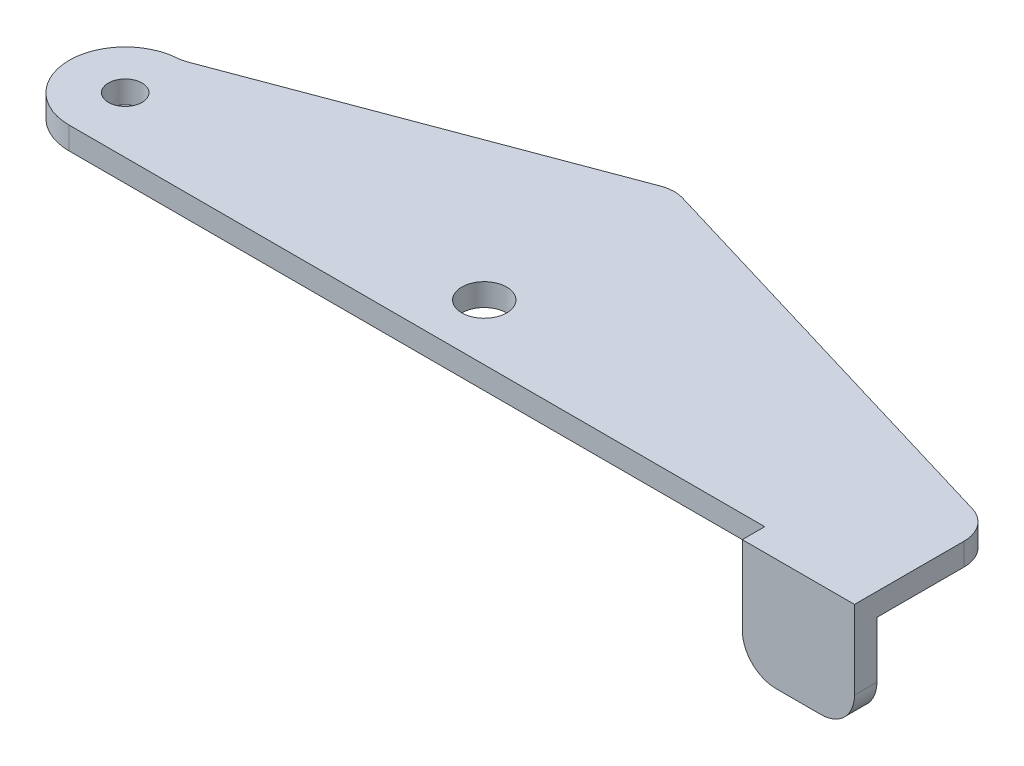
ISO-10303-21;
HEADER;
FILE_DESCRIPTION(('STEP AP214'),'2;1');
FILE_NAME('part.step','',(''),(''),'','','');
FILE_SCHEMA(('AUTOMOTIVE_DESIGN { 1 0 10303 214 1 1 1 1 }'));
ENDSEC;
DATA;
#1=APPLICATION_CONTEXT('core data for automotive mechanical design processes');
#2=APPLICATION_PROTOCOL_DEFINITION('international standard','automotive_design',2000,#1);
#3=PRODUCT_CONTEXT('',#1,'mechanical');
#4=PRODUCT('Part','Part','',(#3));
#5=PRODUCT_RELATED_PRODUCT_CATEGORY('part','',(#4));
#6=PRODUCT_DEFINITION_FORMATION('','',#4);
#7=PRODUCT_DEFINITION_CONTEXT('part definition',#1,'design');
#8=PRODUCT_DEFINITION('design','',#6,#7);
#9=PRODUCT_DEFINITION_SHAPE('','',#8);
#10=(LENGTH_UNIT() NAMED_UNIT(*) SI_UNIT(.MILLI.,.METRE.));
#11=(NAMED_UNIT(*) PLANE_ANGLE_UNIT() SI_UNIT($,.RADIAN.));
#12=(NAMED_UNIT(*) SI_UNIT($,.STERADIAN.) SOLID_ANGLE_UNIT());
#13=UNCERTAINTY_MEASURE_WITH_UNIT(LENGTH_MEASURE(1.E-05),#10,'distance_accuracy_value','');
#14=(GEOMETRIC_REPRESENTATION_CONTEXT(3) GLOBAL_UNCERTAINTY_ASSIGNED_CONTEXT((#13)) GLOBAL_UNIT_ASSIGNED_CONTEXT((#10,
#11,#12)) REPRESENTATION_CONTEXT('',''));
#15=CARTESIAN_POINT('',(0.,0.,0.));
#16=DIRECTION('',(0.,0.,1.));
#17=DIRECTION('',(1.,0.,0.));
#18=AXIS2_PLACEMENT_3D('',#15,#16,#17);
#19=CARTESIAN_POINT('',(-32.,2.,0.));
#20=DIRECTION('',(0.,1.,0.));
#21=DIRECTION('',(0.,0.,1.));
#22=AXIS2_PLACEMENT_3D('',#19,#20,#21);
#23=PLANE('',#22);
#24=CARTESIAN_POINT('',(-32.,2.,0.));
#25=DIRECTION('',(0.,1.,0.));
#26=DIRECTION('',(0.,0.,1.));
#27=AXIS2_PLACEMENT_3D('',#24,#25,#26);
#28=CIRCLE('',#27,1.5);
#29=CARTESIAN_POINT('',(-32.,2.,1.49999999999993));
#30=VERTEX_POINT('',#29);
#31=EDGE_CURVE('E180',#30,#30,#28,.T.);
#32=ORIENTED_EDGE('',*,*,#31,.F.);
#33=EDGE_LOOP('',(#32));
#34=FACE_BOUND('',#33,.T.);
#35=DIRECTION('',(0.,0.,-1.));
#36=VECTOR('',#35,1.);
#37=CARTESIAN_POINT('',(40.,2.,-5.00000000000006));
#38=LINE('',#37,#36);
#39=CARTESIAN_POINT('',(40.,2.,6.99999999999992));
#40=VERTEX_POINT('',#39);
#41=CARTESIAN_POINT('',(40.,2.,-2.76790804732689));
#42=VERTEX_POINT('',#41);
#43=EDGE_CURVE('E164',#40,#42,#38,.T.);
#44=ORIENTED_EDGE('',*,*,#43,.T.);
#45=CARTESIAN_POINT('',(37.,2.,-2.76790804732689));
#46=DIRECTION('',(0.,1.,0.));
#47=DIRECTION('',(0.,0.,1.));
#48=AXIS2_PLACEMENT_3D('',#45,#46,#47);
#49=CIRCLE('',#48,3.);
#50=CARTESIAN_POINT('',(37.862043656699,2.,-5.64138690299034));
#51=VERTEX_POINT('',#50);
#52=EDGE_CURVE('E212',#42,#51,#49,.T.);
#53=ORIENTED_EDGE('',*,*,#52,.T.);
#54=DIRECTION('',(-0.957826285221152,0.,-0.287347885566344));
#55=VECTOR('',#54,1.);
#56=CARTESIAN_POINT('',(0.,2.,-17.));
#57=LINE('',#56,#55);
#58=CARTESIAN_POINT('',(0.968576177915203,2.,-16.7094271466254));
#59=VERTEX_POINT('',#58);
#60=EDGE_CURVE('E166',#51,#59,#57,.T.);
#61=ORIENTED_EDGE('',*,*,#60,.T.);
#62=CARTESIAN_POINT('',(0.10653252121617,2.,-13.835948290962));
#63=DIRECTION('',(0.,1.,0.));
#64=DIRECTION('',(0.,0.,1.));
#65=AXIS2_PLACEMENT_3D('',#62,#63,#64);
#66=CIRCLE('',#65,3.);
#67=CARTESIAN_POINT('',(-0.946837803549001,2.,-16.6449358236691));
#68=VERTEX_POINT('',#67);
#69=EDGE_CURVE('E210',#59,#68,#66,.T.);
#70=ORIENTED_EDGE('',*,*,#69,.T.);
#71=DIRECTION('',(-0.936329177569045,0.,0.35112344158839));
#72=VECTOR('',#71,1.);
#73=CARTESIAN_POINT('',(-32.,2.,-5.00000000000005));
#74=LINE('',#73,#72);
#75=CARTESIAN_POINT('',(-31.5517492453461,2.,-5.16809403299527));
#76=VERTEX_POINT('',#75);
#77=EDGE_CURVE('E174',#68,#76,#74,.T.);
#78=ORIENTED_EDGE('',*,*,#77,.T.);
#79=CARTESIAN_POINT('',(-32.6051195701112,2.,-7.97708156570241));
#80=DIRECTION('',(0.,1.,0.));
#81=DIRECTION('',(0.,0.,1.));
#82=AXIS2_PLACEMENT_3D('',#79,#80,#81);
#83=CIRCLE('',#82,3.);
#84=CARTESIAN_POINT('',(-32.3781997313195,2.,-4.98567597856403));
#85=VERTEX_POINT('',#84);
#86=EDGE_CURVE('E216',#76,#85,#83,.F.);
#87=ORIENTED_EDGE('',*,*,#86,.T.);
#88=CARTESIAN_POINT('',(-32.,2.,0.));
#89=DIRECTION('',(0.,1.,0.));
#90=DIRECTION('',(0.,0.,1.));
#91=AXIS2_PLACEMENT_3D('',#88,#89,#90);
#92=CIRCLE('',#91,4.99999999999999);
#93=CARTESIAN_POINT('',(-32.,2.,4.99999999999992));
#94=VERTEX_POINT('',#93);
#95=EDGE_CURVE('E163',#85,#94,#92,.T.);
#96=ORIENTED_EDGE('',*,*,#95,.T.);
#97=DIRECTION('',(1.,0.,0.));
#98=VECTOR('',#97,1.);
#99=CARTESIAN_POINT('',(40.,2.,4.99999999999994));
#100=LINE('',#99,#98);
#101=CARTESIAN_POINT('',(30.,2.,4.99999999999992));
#102=VERTEX_POINT('',#101);
#103=EDGE_CURVE('E153',#94,#102,#100,.T.);
#104=ORIENTED_EDGE('',*,*,#103,.T.);
#105=DIRECTION('',(0.,0.,1.));
#106=VECTOR('',#105,1.);
#107=CARTESIAN_POINT('',(30.,2.,4.99999999999992));
#108=LINE('',#107,#106);
#109=CARTESIAN_POINT('',(30.,2.,6.99999999999992));
#110=VERTEX_POINT('',#109);
#111=EDGE_CURVE('E134',#102,#110,#108,.T.);
#112=ORIENTED_EDGE('',*,*,#111,.T.);
#113=DIRECTION('',(1.,0.,0.));
#114=VECTOR('',#113,1.);
#115=CARTESIAN_POINT('',(40.,2.,6.99999999999992));
#116=LINE('',#115,#114);
#117=EDGE_CURVE('E146',#110,#40,#116,.T.);
#118=ORIENTED_EDGE('',*,*,#117,.T.);
#119=EDGE_LOOP('',(#44,#53,#61,#70,#78,#87,#96,#104,#112,#118));
#120=FACE_BOUND('',#119,.T.);
#121=CARTESIAN_POINT('',(0.,2.,0.));
#122=DIRECTION('',(0.,1.,0.));
#123=DIRECTION('',(0.,0.,1.));
#124=AXIS2_PLACEMENT_3D('',#121,#122,#123);
#125=CIRCLE('',#124,2.);
#126=CARTESIAN_POINT('',(0.,2.,2.));
#127=VERTEX_POINT('',#126);
#128=EDGE_CURVE('E258',#127,#127,#125,.T.);
#129=ORIENTED_EDGE('',*,*,#128,.F.);
#130=EDGE_LOOP('',(#129));
#131=FACE_BOUND('',#130,.T.);
#132=ADVANCED_FACE('F34',(#34,#120,#131),#23,.T.);
#133=CARTESIAN_POINT('',(-32.,0.,0.));
#134=DIRECTION('',(0.,1.,0.));
#135=DIRECTION('',(0.,0.,1.));
#136=AXIS2_PLACEMENT_3D('',#133,#134,#135);
#137=PLANE('',#136);
#138=CARTESIAN_POINT('',(-32.,0.,0.));
#139=DIRECTION('',(0.,1.,0.));
#140=DIRECTION('',(0.,0.,1.));
#141=AXIS2_PLACEMENT_3D('',#138,#139,#140);
#142=CIRCLE('',#141,1.5);
#143=CARTESIAN_POINT('',(-32.,0.,1.49999999999993));
#144=VERTEX_POINT('',#143);
#145=EDGE_CURVE('E261',#144,#144,#142,.T.);
#146=ORIENTED_EDGE('',*,*,#145,.T.);
#147=EDGE_LOOP('',(#146));
#148=FACE_BOUND('',#147,.T.);
#149=DIRECTION('',(-0.957826285221152,0.,-0.287347885566344));
#150=VECTOR('',#149,1.);
#151=CARTESIAN_POINT('',(0.,0.,-17.));
#152=LINE('',#151,#150);
#153=CARTESIAN_POINT('',(37.862043656699,0.,-5.64138690299034));
#154=VERTEX_POINT('',#153);
#155=CARTESIAN_POINT('',(0.968576177915203,0.,-16.7094271466254));
#156=VERTEX_POINT('',#155);
#157=EDGE_CURVE('E185',#154,#156,#152,.T.);
#158=ORIENTED_EDGE('',*,*,#157,.F.);
#159=CARTESIAN_POINT('',(37.,0.,-2.76790804732689));
#160=DIRECTION('',(0.,1.,0.));
#161=DIRECTION('',(0.,0.,1.));
#162=AXIS2_PLACEMENT_3D('',#159,#160,#161);
#163=CIRCLE('',#162,3.);
#164=CARTESIAN_POINT('',(40.,0.,-2.76790804732689));
#165=VERTEX_POINT('',#164);
#166=EDGE_CURVE('E206',#154,#165,#163,.F.);
#167=ORIENTED_EDGE('',*,*,#166,.T.);
#168=DIRECTION('',(0.,0.,-1.));
#169=VECTOR('',#168,1.);
#170=CARTESIAN_POINT('',(40.,0.,-5.00000000000006));
#171=LINE('',#170,#169);
#172=CARTESIAN_POINT('',(40.,0.,4.99999999999994));
#173=VERTEX_POINT('',#172);
#174=EDGE_CURVE('E182',#173,#165,#171,.T.);
#175=ORIENTED_EDGE('',*,*,#174,.F.);
#176=DIRECTION('',(-1.,0.,0.));
#177=VECTOR('',#176,1.);
#178=CARTESIAN_POINT('',(-32.,0.,4.99999999999994));
#179=LINE('',#178,#177);
#180=CARTESIAN_POINT('',(30.,0.,4.99999999999992));
#181=VERTEX_POINT('',#180);
#182=EDGE_CURVE('E240',#173,#181,#179,.T.);
#183=ORIENTED_EDGE('',*,*,#182,.T.);
#184=DIRECTION('',(1.,0.,0.));
#185=VECTOR('',#184,1.);
#186=CARTESIAN_POINT('',(40.,0.,4.99999999999994));
#187=LINE('',#186,#185);
#188=CARTESIAN_POINT('',(-32.,0.,4.99999999999992));
#189=VERTEX_POINT('',#188);
#190=EDGE_CURVE('E156',#189,#181,#187,.T.);
#191=ORIENTED_EDGE('',*,*,#190,.F.);
#192=CARTESIAN_POINT('',(-32.,0.,0.));
#193=DIRECTION('',(0.,1.,0.));
#194=DIRECTION('',(0.,0.,1.));
#195=AXIS2_PLACEMENT_3D('',#192,#193,#194);
#196=CIRCLE('',#195,4.99999999999999);
#197=CARTESIAN_POINT('',(-32.3781997313195,0.,-4.98567597856403));
#198=VERTEX_POINT('',#197);
#199=EDGE_CURVE('E178',#198,#189,#196,.T.);
#200=ORIENTED_EDGE('',*,*,#199,.F.);
#201=CARTESIAN_POINT('',(-32.6051195701112,0.,-7.97708156570241));
#202=DIRECTION('',(0.,1.,0.));
#203=DIRECTION('',(0.,0.,1.));
#204=AXIS2_PLACEMENT_3D('',#201,#202,#203);
#205=CIRCLE('',#204,3.);
#206=CARTESIAN_POINT('',(-31.5517492453461,0.,-5.16809403299527));
#207=VERTEX_POINT('',#206);
#208=EDGE_CURVE('E214',#198,#207,#205,.T.);
#209=ORIENTED_EDGE('',*,*,#208,.T.);
#210=DIRECTION('',(-0.936329177569045,0.,0.35112344158839));
#211=VECTOR('',#210,1.);
#212=CARTESIAN_POINT('',(-32.,0.,-5.00000000000005));
#213=LINE('',#212,#211);
#214=CARTESIAN_POINT('',(-0.946837803549001,0.,-16.6449358236691));
#215=VERTEX_POINT('',#214);
#216=EDGE_CURVE('E168',#215,#207,#213,.T.);
#217=ORIENTED_EDGE('',*,*,#216,.F.);
#218=CARTESIAN_POINT('',(0.10653252121617,0.,-13.835948290962));
#219=DIRECTION('',(0.,1.,0.));
#220=DIRECTION('',(0.,0.,1.));
#221=AXIS2_PLACEMENT_3D('',#218,#219,#220);
#222=CIRCLE('',#221,3.);
#223=EDGE_CURVE('E204',#215,#156,#222,.F.);
#224=ORIENTED_EDGE('',*,*,#223,.T.);
#225=EDGE_LOOP('',(#158,#167,#175,#183,#191,#200,#209,#217,#224));
#226=FACE_BOUND('',#225,.T.);
#227=CARTESIAN_POINT('',(0.,0.,0.));
#228=DIRECTION('',(0.,1.,0.));
#229=DIRECTION('',(0.,0.,1.));
#230=AXIS2_PLACEMENT_3D('',#227,#228,#229);
#231=CIRCLE('',#230,2.);
#232=CARTESIAN_POINT('',(0.,0.,2.));
#233=VERTEX_POINT('',#232);
#234=EDGE_CURVE('E257',#233,#233,#231,.T.);
#235=ORIENTED_EDGE('',*,*,#234,.T.);
#236=EDGE_LOOP('',(#235));
#237=FACE_BOUND('',#236,.T.);
#238=ADVANCED_FACE('F268',(#148,#226,#237),#137,.F.);
#239=CARTESIAN_POINT('',(-32.,2.,0.));
#240=DIRECTION('',(0.,-1.,0.));
#241=DIRECTION('',(0.,0.,-1.));
#242=AXIS2_PLACEMENT_3D('',#239,#240,#241);
#243=CYLINDRICAL_SURFACE('',#242,4.99999999999999);
#244=ORIENTED_EDGE('',*,*,#95,.F.);
#245=DIRECTION('',(0.,-1.,0.));
#246=VECTOR('',#245,1.);
#247=CARTESIAN_POINT('',(-32.3781997313195,2.,-4.98567597856403));
#248=LINE('',#247,#246);
#249=EDGE_CURVE('E191',#85,#198,#248,.T.);
#250=ORIENTED_EDGE('',*,*,#249,.T.);
#251=ORIENTED_EDGE('',*,*,#199,.T.);
#252=DIRECTION('',(0.,-1.,0.));
#253=VECTOR('',#252,1.);
#254=CARTESIAN_POINT('',(-32.,2.,4.99999999999992));
#255=LINE('',#254,#253);
#256=EDGE_CURVE('E177',#94,#189,#255,.T.);
#257=ORIENTED_EDGE('',*,*,#256,.F.);
#258=EDGE_LOOP('',(#244,#250,#251,#257));
#259=FACE_BOUND('',#258,.T.);
#260=ADVANCED_FACE('F292',(#259),#243,.T.);
#261=CARTESIAN_POINT('',(40.,2.,4.99999999999994));
#262=DIRECTION('',(0.,0.,-1.));
#263=DIRECTION('',(-1.,0.,0.));
#264=AXIS2_PLACEMENT_3D('',#261,#262,#263);
#265=PLANE('',#264);
#266=ORIENTED_EDGE('',*,*,#190,.T.);
#267=DIRECTION('',(0.,1.,0.));
#268=VECTOR('',#267,1.);
#269=CARTESIAN_POINT('',(30.,-8.,4.99999999999992));
#270=LINE('',#269,#268);
#271=EDGE_CURVE('E138',#181,#102,#270,.T.);
#272=ORIENTED_EDGE('',*,*,#271,.T.);
#273=ORIENTED_EDGE('',*,*,#103,.F.);
#274=ORIENTED_EDGE('',*,*,#256,.T.);
#275=EDGE_LOOP('',(#266,#272,#273,#274));
#276=FACE_BOUND('',#275,.T.);
#277=ADVANCED_FACE('F151',(#276),#265,.F.);
#278=CARTESIAN_POINT('',(40.,2.,-5.00000000000006));
#279=DIRECTION('',(-1.,0.,0.));
#280=DIRECTION('',(0.,0.,1.));
#281=AXIS2_PLACEMENT_3D('',#278,#279,#280);
#282=PLANE('',#281);
#283=DIRECTION('',(0.,1.,0.));
#284=VECTOR('',#283,1.);
#285=CARTESIAN_POINT('',(40.,-8.,6.99999999999992));
#286=LINE('',#285,#284);
#287=CARTESIAN_POINT('',(40.,-5.,6.99999999999992));
#288=VERTEX_POINT('',#287);
#289=EDGE_CURVE('E232',#288,#40,#286,.T.);
#290=ORIENTED_EDGE('',*,*,#289,.F.);
#291=DIRECTION('',(0.,0.,-1.));
#292=VECTOR('',#291,1.);
#293=CARTESIAN_POINT('',(40.,-5.,4.99999999999992));
#294=LINE('',#293,#292);
#295=CARTESIAN_POINT('',(40.,-5.,4.99999999999992));
#296=VERTEX_POINT('',#295);
#297=EDGE_CURVE('E218',#288,#296,#294,.T.);
#298=ORIENTED_EDGE('',*,*,#297,.T.);
#299=DIRECTION('',(0.,1.,0.));
#300=VECTOR('',#299,1.);
#301=CARTESIAN_POINT('',(40.,-8.,4.99999999999992));
#302=LINE('',#301,#300);
#303=EDGE_CURVE('E158',#296,#173,#302,.T.);
#304=ORIENTED_EDGE('',*,*,#303,.T.);
#305=ORIENTED_EDGE('',*,*,#174,.T.);
#306=DIRECTION('',(0.,-1.,0.));
#307=VECTOR('',#306,1.);
#308=CARTESIAN_POINT('',(40.,2.,-2.76790804732689));
#309=LINE('',#308,#307);
#310=EDGE_CURVE('E208',#165,#42,#309,.F.);
#311=ORIENTED_EDGE('',*,*,#310,.T.);
#312=ORIENTED_EDGE('',*,*,#43,.F.);
#313=EDGE_LOOP('',(#290,#298,#304,#305,#311,#312));
#314=FACE_BOUND('',#313,.T.);
#315=ADVANCED_FACE('F238',(#314),#282,.F.);
#316=CARTESIAN_POINT('',(0.,2.,-17.));
#317=DIRECTION('',(-0.287347885566344,0.,0.957826285221152));
#318=DIRECTION('',(0.957826285221152,0.,0.287347885566344));
#319=AXIS2_PLACEMENT_3D('',#316,#317,#318);
#320=PLANE('',#319);
#321=ORIENTED_EDGE('',*,*,#60,.F.);
#322=DIRECTION('',(0.,-1.,0.));
#323=VECTOR('',#322,1.);
#324=CARTESIAN_POINT('',(37.862043656699,2.,-5.64138690299034));
#325=LINE('',#324,#323);
#326=EDGE_CURVE('E201',#51,#154,#325,.T.);
#327=ORIENTED_EDGE('',*,*,#326,.T.);
#328=ORIENTED_EDGE('',*,*,#157,.T.);
#329=DIRECTION('',(0.,-1.,0.));
#330=VECTOR('',#329,1.);
#331=CARTESIAN_POINT('',(0.968576177915202,2.,-16.7094271466254));
#332=LINE('',#331,#330);
#333=EDGE_CURVE('E199',#156,#59,#332,.F.);
#334=ORIENTED_EDGE('',*,*,#333,.T.);
#335=EDGE_LOOP('',(#321,#327,#328,#334));
#336=FACE_BOUND('',#335,.T.);
#337=ADVANCED_FACE('F283',(#336),#320,.F.);
#338=CARTESIAN_POINT('',(-32.,2.,-5.00000000000005));
#339=DIRECTION('',(0.35112344158839,0.,0.936329177569045));
#340=DIRECTION('',(0.936329177569045,0.,-0.35112344158839));
#341=AXIS2_PLACEMENT_3D('',#338,#339,#340);
#342=PLANE('',#341);
#343=ORIENTED_EDGE('',*,*,#216,.T.);
#344=DIRECTION('',(0.,1.,0.));
#345=VECTOR('',#344,1.);
#346=CARTESIAN_POINT('',(-31.5517492453461,2.,-5.16809403299527));
#347=LINE('',#346,#345);
#348=EDGE_CURVE('E197',#207,#76,#347,.T.);
#349=ORIENTED_EDGE('',*,*,#348,.T.);
#350=ORIENTED_EDGE('',*,*,#77,.F.);
#351=DIRECTION('',(0.,-1.,0.));
#352=VECTOR('',#351,1.);
#353=CARTESIAN_POINT('',(-0.946837803549001,2.,-16.6449358236691));
#354=LINE('',#353,#352);
#355=EDGE_CURVE('E194',#68,#215,#354,.T.);
#356=ORIENTED_EDGE('',*,*,#355,.T.);
#357=EDGE_LOOP('',(#343,#349,#350,#356));
#358=FACE_BOUND('',#357,.T.);
#359=ADVANCED_FACE('F274',(#358),#342,.F.);
#360=CARTESIAN_POINT('',(-32.,2.,0.));
#361=DIRECTION('',(0.,-1.,0.));
#362=DIRECTION('',(0.,0.,-1.));
#363=AXIS2_PLACEMENT_3D('',#360,#361,#362);
#364=CYLINDRICAL_SURFACE('',#363,1.5);
#365=ORIENTED_EDGE('',*,*,#31,.T.);
#366=EDGE_LOOP('',(#365));
#367=FACE_BOUND('',#366,.T.);
#368=ORIENTED_EDGE('',*,*,#145,.F.);
#369=EDGE_LOOP('',(#368));
#370=FACE_BOUND('',#369,.T.);
#371=ADVANCED_FACE('F271',(#367,#370),#364,.F.);
#372=CARTESIAN_POINT('',(0.,2.,0.));
#373=DIRECTION('',(0.,-1.,0.));
#374=DIRECTION('',(0.,0.,-1.));
#375=AXIS2_PLACEMENT_3D('',#372,#373,#374);
#376=CYLINDRICAL_SURFACE('',#375,2.);
#377=ORIENTED_EDGE('',*,*,#128,.T.);
#378=EDGE_LOOP('',(#377));
#379=FACE_BOUND('',#378,.T.);
#380=ORIENTED_EDGE('',*,*,#234,.F.);
#381=EDGE_LOOP('',(#380));
#382=FACE_BOUND('',#381,.T.);
#383=ADVANCED_FACE('F273',(#379,#382),#376,.F.);
#384=CARTESIAN_POINT('',(40.,-8.,4.99999999999992));
#385=DIRECTION('',(0.,0.,-1.));
#386=DIRECTION('',(-1.,0.,0.));
#387=AXIS2_PLACEMENT_3D('',#384,#385,#386);
#388=PLANE('',#387);
#389=ORIENTED_EDGE('',*,*,#303,.F.);
#390=CARTESIAN_POINT('',(37.,-5.,4.99999999999992));
#391=DIRECTION('',(0.,0.,-1.));
#392=DIRECTION('',(-1.,0.,0.));
#393=AXIS2_PLACEMENT_3D('',#390,#391,#392);
#394=CIRCLE('',#393,3.);
#395=CARTESIAN_POINT('',(37.,-8.,4.99999999999992));
#396=VERTEX_POINT('',#395);
#397=EDGE_CURVE('E223',#296,#396,#394,.T.);
#398=ORIENTED_EDGE('',*,*,#397,.T.);
#399=DIRECTION('',(-1.,0.,0.));
#400=VECTOR('',#399,1.);
#401=CARTESIAN_POINT('',(40.,-8.,4.99999999999992));
#402=LINE('',#401,#400);
#403=CARTESIAN_POINT('',(33.,-8.,4.99999999999992));
#404=VERTEX_POINT('',#403);
#405=EDGE_CURVE('E246',#396,#404,#402,.T.);
#406=ORIENTED_EDGE('',*,*,#405,.T.);
#407=CARTESIAN_POINT('',(33.,-5.,4.99999999999992));
#408=DIRECTION('',(0.,0.,-1.));
#409=DIRECTION('',(-1.,0.,0.));
#410=AXIS2_PLACEMENT_3D('',#407,#408,#409);
#411=CIRCLE('',#410,3.);
#412=CARTESIAN_POINT('',(30.,-5.,4.99999999999992));
#413=VERTEX_POINT('',#412);
#414=EDGE_CURVE('E221',#404,#413,#411,.T.);
#415=ORIENTED_EDGE('',*,*,#414,.T.);
#416=EDGE_CURVE('E157',#413,#181,#270,.T.);
#417=ORIENTED_EDGE('',*,*,#416,.T.);
#418=ORIENTED_EDGE('',*,*,#182,.F.);
#419=EDGE_LOOP('',(#389,#398,#406,#415,#417,#418));
#420=FACE_BOUND('',#419,.T.);
#421=ADVANCED_FACE('F245',(#420),#388,.T.);
#422=CARTESIAN_POINT('',(40.,-8.,6.99999999999992));
#423=DIRECTION('',(0.,0.,1.));
#424=DIRECTION('',(1.,0.,0.));
#425=AXIS2_PLACEMENT_3D('',#422,#423,#424);
#426=PLANE('',#425);
#427=DIRECTION('',(1.,0.,0.));
#428=VECTOR('',#427,1.);
#429=CARTESIAN_POINT('',(40.,-8.,6.99999999999992));
#430=LINE('',#429,#428);
#431=CARTESIAN_POINT('',(33.,-8.,6.99999999999992));
#432=VERTEX_POINT('',#431);
#433=CARTESIAN_POINT('',(37.,-8.,6.99999999999992));
#434=VERTEX_POINT('',#433);
#435=EDGE_CURVE('E234',#432,#434,#430,.T.);
#436=ORIENTED_EDGE('',*,*,#435,.T.);
#437=CARTESIAN_POINT('',(37.,-5.,6.99999999999992));
#438=DIRECTION('',(0.,0.,1.));
#439=DIRECTION('',(1.,0.,0.));
#440=AXIS2_PLACEMENT_3D('',#437,#438,#439);
#441=CIRCLE('',#440,3.);
#442=EDGE_CURVE('E42',#434,#288,#441,.T.);
#443=ORIENTED_EDGE('',*,*,#442,.T.);
#444=ORIENTED_EDGE('',*,*,#289,.T.);
#445=ORIENTED_EDGE('',*,*,#117,.F.);
#446=DIRECTION('',(0.,1.,0.));
#447=VECTOR('',#446,1.);
#448=CARTESIAN_POINT('',(30.,-8.,6.99999999999992));
#449=LINE('',#448,#447);
#450=CARTESIAN_POINT('',(30.,-5.,6.99999999999992));
#451=VERTEX_POINT('',#450);
#452=EDGE_CURVE('E141',#451,#110,#449,.T.);
#453=ORIENTED_EDGE('',*,*,#452,.F.);
#454=CARTESIAN_POINT('',(33.,-5.,6.99999999999992));
#455=DIRECTION('',(0.,0.,1.));
#456=DIRECTION('',(1.,0.,0.));
#457=AXIS2_PLACEMENT_3D('',#454,#455,#456);
#458=CIRCLE('',#457,3.);
#459=EDGE_CURVE('E49',#451,#432,#458,.T.);
#460=ORIENTED_EDGE('',*,*,#459,.T.);
#461=EDGE_LOOP('',(#436,#443,#444,#445,#453,#460));
#462=FACE_BOUND('',#461,.T.);
#463=ADVANCED_FACE('F231',(#462),#426,.T.);
#464=CARTESIAN_POINT('',(30.,-8.,4.99999999999992));
#465=DIRECTION('',(-1.,0.,0.));
#466=DIRECTION('',(0.,0.,1.));
#467=AXIS2_PLACEMENT_3D('',#464,#465,#466);
#468=PLANE('',#467);
#469=ORIENTED_EDGE('',*,*,#416,.F.);
#470=DIRECTION('',(0.,0.,1.));
#471=VECTOR('',#470,1.);
#472=CARTESIAN_POINT('',(30.,-5.,4.99999999999992));
#473=LINE('',#472,#471);
#474=EDGE_CURVE('E11',#413,#451,#473,.T.);
#475=ORIENTED_EDGE('',*,*,#474,.T.);
#476=ORIENTED_EDGE('',*,*,#452,.T.);
#477=ORIENTED_EDGE('',*,*,#111,.F.);
#478=ORIENTED_EDGE('',*,*,#271,.F.);
#479=EDGE_LOOP('',(#469,#475,#476,#477,#478));
#480=FACE_BOUND('',#479,.T.);
#481=ADVANCED_FACE('F137',(#480),#468,.T.);
#482=CARTESIAN_POINT('',(0.,-8.,0.));
#483=DIRECTION('',(0.,-1.,0.));
#484=DIRECTION('',(0.,0.,-1.));
#485=AXIS2_PLACEMENT_3D('',#482,#483,#484);
#486=PLANE('',#485);
#487=ORIENTED_EDGE('',*,*,#405,.F.);
#488=DIRECTION('',(0.,0.,-1.));
#489=VECTOR('',#488,1.);
#490=CARTESIAN_POINT('',(37.,-8.,6.99999999999992));
#491=LINE('',#490,#489);
#492=EDGE_CURVE('E56',#396,#434,#491,.F.);
#493=ORIENTED_EDGE('',*,*,#492,.T.);
#494=ORIENTED_EDGE('',*,*,#435,.F.);
#495=DIRECTION('',(0.,0.,1.));
#496=VECTOR('',#495,1.);
#497=CARTESIAN_POINT('',(33.,-8.,0.));
#498=LINE('',#497,#496);
#499=EDGE_CURVE('E225',#432,#404,#498,.F.);
#500=ORIENTED_EDGE('',*,*,#499,.T.);
#501=EDGE_LOOP('',(#487,#493,#494,#500));
#502=FACE_BOUND('',#501,.T.);
#503=ADVANCED_FACE('F249',(#502),#486,.T.);
#504=CARTESIAN_POINT('',(-32.6051195701112,2.,-7.97708156570241));
#505=DIRECTION('',(0.,-1.,0.));
#506=DIRECTION('',(0.,0.,-1.));
#507=AXIS2_PLACEMENT_3D('',#504,#505,#506);
#508=CYLINDRICAL_SURFACE('',#507,3.);
#509=ORIENTED_EDGE('',*,*,#86,.F.);
#510=ORIENTED_EDGE('',*,*,#348,.F.);
#511=ORIENTED_EDGE('',*,*,#208,.F.);
#512=ORIENTED_EDGE('',*,*,#249,.F.);
#513=EDGE_LOOP('',(#509,#510,#511,#512));
#514=FACE_BOUND('',#513,.T.);
#515=ADVANCED_FACE('F306',(#514),#508,.F.);
#516=CARTESIAN_POINT('',(37.,2.,-2.76790804732689));
#517=DIRECTION('',(0.,-1.,0.));
#518=DIRECTION('',(0.,0.,-1.));
#519=AXIS2_PLACEMENT_3D('',#516,#517,#518);
#520=CYLINDRICAL_SURFACE('',#519,3.);
#521=ORIENTED_EDGE('',*,*,#52,.F.);
#522=ORIENTED_EDGE('',*,*,#310,.F.);
#523=ORIENTED_EDGE('',*,*,#166,.F.);
#524=ORIENTED_EDGE('',*,*,#326,.F.);
#525=EDGE_LOOP('',(#521,#522,#523,#524));
#526=FACE_BOUND('',#525,.T.);
#527=ADVANCED_FACE('F309',(#526),#520,.T.);
#528=CARTESIAN_POINT('',(0.10653252121617,2.,-13.835948290962));
#529=DIRECTION('',(0.,-1.,0.));
#530=DIRECTION('',(0.,0.,-1.));
#531=AXIS2_PLACEMENT_3D('',#528,#529,#530);
#532=CYLINDRICAL_SURFACE('',#531,3.);
#533=ORIENTED_EDGE('',*,*,#69,.F.);
#534=ORIENTED_EDGE('',*,*,#333,.F.);
#535=ORIENTED_EDGE('',*,*,#223,.F.);
#536=ORIENTED_EDGE('',*,*,#355,.F.);
#537=EDGE_LOOP('',(#533,#534,#535,#536));
#538=FACE_BOUND('',#537,.T.);
#539=ADVANCED_FACE('F313',(#538),#532,.T.);
#540=CARTESIAN_POINT('',(37.,-5.,-5.00000000000006));
#541=DIRECTION('',(0.,0.,1.));
#542=DIRECTION('',(1.,0.,0.));
#543=AXIS2_PLACEMENT_3D('',#540,#541,#542);
#544=CYLINDRICAL_SURFACE('',#543,3.);
#545=ORIENTED_EDGE('',*,*,#442,.F.);
#546=ORIENTED_EDGE('',*,*,#492,.F.);
#547=ORIENTED_EDGE('',*,*,#397,.F.);
#548=ORIENTED_EDGE('',*,*,#297,.F.);
#549=EDGE_LOOP('',(#545,#546,#547,#548));
#550=FACE_BOUND('',#549,.T.);
#551=ADVANCED_FACE('F242',(#550),#544,.T.);
#552=CARTESIAN_POINT('',(33.,-5.,4.99999999999992));
#553=DIRECTION('',(0.,0.,1.));
#554=DIRECTION('',(1.,0.,0.));
#555=AXIS2_PLACEMENT_3D('',#552,#553,#554);
#556=CYLINDRICAL_SURFACE('',#555,3.);
#557=ORIENTED_EDGE('',*,*,#414,.F.);
#558=ORIENTED_EDGE('',*,*,#499,.F.);
#559=ORIENTED_EDGE('',*,*,#459,.F.);
#560=ORIENTED_EDGE('',*,*,#474,.F.);
#561=EDGE_LOOP('',(#557,#558,#559,#560));
#562=FACE_BOUND('',#561,.T.);
#563=ADVANCED_FACE('F36',(#562),#556,.T.);
#564=CLOSED_SHELL('',(#132,#238,#260,#277,#315,#337,#359,#371,#383,#421,#463,#481,#503,#515,
#527,#539,#551,#563));
#565=MANIFOLD_SOLID_BREP('B2',#564);
#566=ADVANCED_BREP_SHAPE_REPRESENTATION('',(#18,#565),#14);
#567=SHAPE_DEFINITION_REPRESENTATION(#9,#566);
ENDSEC;
END-ISO-10303-21;
